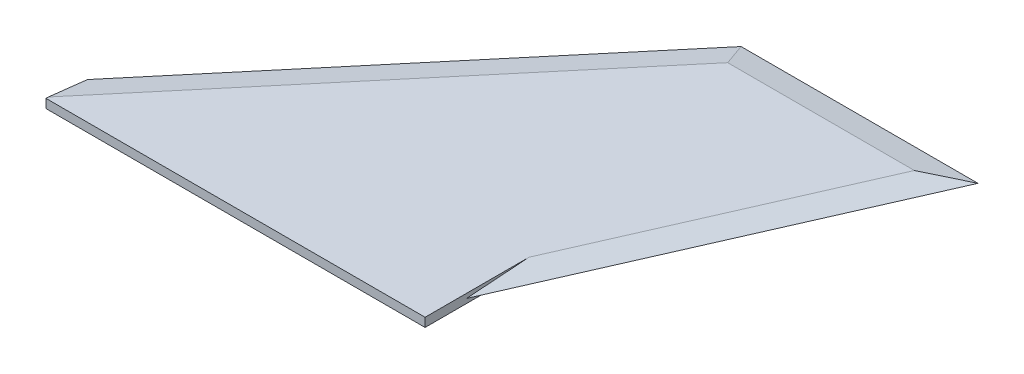
ISO-10303-21;
HEADER;
FILE_DESCRIPTION(('STEP AP214'),'2;1');
FILE_NAME('part.step','',(''),(''),'','','');
FILE_SCHEMA(('AUTOMOTIVE_DESIGN { 1 0 10303 214 1 1 1 1 }'));
ENDSEC;
DATA;
#1=APPLICATION_CONTEXT('core data for automotive mechanical design processes');
#2=APPLICATION_PROTOCOL_DEFINITION('international standard','automotive_design',2000,#1);
#3=PRODUCT_CONTEXT('',#1,'mechanical');
#4=PRODUCT('Part','Part','',(#3));
#5=PRODUCT_RELATED_PRODUCT_CATEGORY('part','',(#4));
#6=PRODUCT_DEFINITION_FORMATION('','',#4);
#7=PRODUCT_DEFINITION_CONTEXT('part definition',#1,'design');
#8=PRODUCT_DEFINITION('design','',#6,#7);
#9=PRODUCT_DEFINITION_SHAPE('','',#8);
#10=(LENGTH_UNIT() NAMED_UNIT(*) SI_UNIT(.MILLI.,.METRE.));
#11=(NAMED_UNIT(*) PLANE_ANGLE_UNIT() SI_UNIT($,.RADIAN.));
#12=(NAMED_UNIT(*) SI_UNIT($,.STERADIAN.) SOLID_ANGLE_UNIT());
#13=UNCERTAINTY_MEASURE_WITH_UNIT(LENGTH_MEASURE(1.E-05),#10,'distance_accuracy_value','');
#14=(GEOMETRIC_REPRESENTATION_CONTEXT(3) GLOBAL_UNCERTAINTY_ASSIGNED_CONTEXT((#13)) GLOBAL_UNIT_ASSIGNED_CONTEXT((#10,
#11,#12)) REPRESENTATION_CONTEXT('',''));
#15=CARTESIAN_POINT('',(0.,0.,0.));
#16=DIRECTION('',(0.,0.,1.));
#17=DIRECTION('',(1.,0.,0.));
#18=AXIS2_PLACEMENT_3D('',#15,#16,#17);
#19=CARTESIAN_POINT('',(101.6,2.3749,0.));
#20=DIRECTION('',(-1.,0.,0.));
#21=DIRECTION('',(0.,0.,1.));
#22=AXIS2_PLACEMENT_3D('',#19,#20,#21);
#23=PLANE('',#22);
#24=DIRECTION('',(0.,0.,-1.));
#25=VECTOR('',#24,1.);
#26=CARTESIAN_POINT('',(101.6,-2.3749,0.));
#27=LINE('',#26,#25);
#28=CARTESIAN_POINT('',(101.6,-2.3749,22.225));
#29=VERTEX_POINT('',#28);
#30=CARTESIAN_POINT('',(101.6,-2.3749,-33.5003114168139));
#31=VERTEX_POINT('',#30);
#32=EDGE_CURVE('E56',#29,#31,#27,.T.);
#33=ORIENTED_EDGE('',*,*,#32,.T.);
#34=DIRECTION('',(0.,0.0707144077689072,0.997496602768096));
#35=VECTOR('',#34,1.);
#36=CARTESIAN_POINT('',(101.6,0.0118757526792581,0.167519227362881));
#37=LINE('',#36,#35);
#38=CARTESIAN_POINT('',(101.6,0.,0.));
#39=VERTEX_POINT('',#38);
#40=EDGE_CURVE('E11',#31,#39,#37,.T.);
#41=ORIENTED_EDGE('',*,*,#40,.T.);
#42=DIRECTION('',(0.,-0.0707144077689075,0.997496602768096));
#43=VECTOR('',#42,1.);
#44=CARTESIAN_POINT('',(101.6,0.0118757526792633,-0.167519227362969));
#45=LINE('',#44,#43);
#46=CARTESIAN_POINT('',(101.6,2.3749,-33.5003114168136));
#47=VERTEX_POINT('',#46);
#48=EDGE_CURVE('E170',#39,#47,#45,.F.);
#49=ORIENTED_EDGE('',*,*,#48,.T.);
#50=DIRECTION('',(0.,0.,-1.));
#51=VECTOR('',#50,1.);
#52=CARTESIAN_POINT('',(101.6,2.3749,0.));
#53=LINE('',#52,#51);
#54=CARTESIAN_POINT('',(101.6,2.3749,22.225));
#55=VERTEX_POINT('',#54);
#56=EDGE_CURVE('E117',#55,#47,#53,.T.);
#57=ORIENTED_EDGE('',*,*,#56,.F.);
#58=DIRECTION('',(0.,-1.,0.));
#59=VECTOR('',#58,1.);
#60=CARTESIAN_POINT('',(101.6,2.3749,22.225));
#61=LINE('',#60,#59);
#62=EDGE_CURVE('E127',#55,#29,#61,.T.);
#63=ORIENTED_EDGE('',*,*,#62,.T.);
#64=EDGE_LOOP('',(#33,#41,#49,#57,#63));
#65=FACE_BOUND('',#64,.T.);
#66=ADVANCED_FACE('F38',(#65),#23,.F.);
#67=CARTESIAN_POINT('',(-101.6,2.3749,22.225));
#68=DIRECTION('',(1.,0.,0.));
#69=DIRECTION('',(0.,0.,-1.));
#70=AXIS2_PLACEMENT_3D('',#67,#68,#69);
#71=PLANE('',#70);
#72=DIRECTION('',(0.,0.112619742461809,0.993638160301745));
#73=VECTOR('',#72,1.);
#74=CARTESIAN_POINT('',(-101.6,-4.59939574289752,-40.5802306467018));
#75=LINE('',#74,#73);
#76=CARTESIAN_POINT('',(-101.6,2.3749,20.9536198122708));
#77=VERTEX_POINT('',#76);
#78=CARTESIAN_POINT('',(-101.6,0.,0.));
#79=VERTEX_POINT('',#78);
#80=EDGE_CURVE('E163',#77,#79,#75,.F.);
#81=ORIENTED_EDGE('',*,*,#80,.T.);
#82=DIRECTION('',(0.,-0.112619742461809,0.993638160301745));
#83=VECTOR('',#82,1.);
#84=CARTESIAN_POINT('',(-101.6,0.,0.));
#85=LINE('',#84,#83);
#86=CARTESIAN_POINT('',(-101.6,-2.3749,20.9536198122709));
#87=VERTEX_POINT('',#86);
#88=EDGE_CURVE('E49',#79,#87,#85,.T.);
#89=ORIENTED_EDGE('',*,*,#88,.T.);
#90=DIRECTION('',(0.,0.,1.));
#91=VECTOR('',#90,1.);
#92=CARTESIAN_POINT('',(-101.6,-2.3749,22.225));
#93=LINE('',#92,#91);
#94=CARTESIAN_POINT('',(-101.6,-2.3749,22.225));
#95=VERTEX_POINT('',#94);
#96=EDGE_CURVE('E123',#87,#95,#93,.T.);
#97=ORIENTED_EDGE('',*,*,#96,.T.);
#98=DIRECTION('',(0.,-1.,0.));
#99=VECTOR('',#98,1.);
#100=CARTESIAN_POINT('',(-101.6,2.3749,22.225));
#101=LINE('',#100,#99);
#102=CARTESIAN_POINT('',(-101.6,2.3749,22.225));
#103=VERTEX_POINT('',#102);
#104=EDGE_CURVE('E120',#103,#95,#101,.T.);
#105=ORIENTED_EDGE('',*,*,#104,.F.);
#106=DIRECTION('',(0.,0.,1.));
#107=VECTOR('',#106,1.);
#108=CARTESIAN_POINT('',(-101.6,2.3749,22.225));
#109=LINE('',#108,#107);
#110=EDGE_CURVE('E106',#77,#103,#109,.T.);
#111=ORIENTED_EDGE('',*,*,#110,.F.);
#112=EDGE_LOOP('',(#81,#89,#97,#105,#111));
#113=FACE_BOUND('',#112,.T.);
#114=ADVANCED_FACE('F121',(#113),#71,.F.);
#115=CARTESIAN_POINT('',(101.6,2.3749,22.225));
#116=DIRECTION('',(0.,0.,-1.));
#117=DIRECTION('',(-1.,0.,0.));
#118=AXIS2_PLACEMENT_3D('',#115,#116,#117);
#119=PLANE('',#118);
#120=DIRECTION('',(1.,0.,0.));
#121=VECTOR('',#120,1.);
#122=CARTESIAN_POINT('',(101.6,-2.3749,22.225));
#123=LINE('',#122,#121);
#124=EDGE_CURVE('E143',#95,#29,#123,.T.);
#125=ORIENTED_EDGE('',*,*,#124,.T.);
#126=ORIENTED_EDGE('',*,*,#62,.F.);
#127=DIRECTION('',(1.,0.,0.));
#128=VECTOR('',#127,1.);
#129=CARTESIAN_POINT('',(101.6,2.3749,22.225));
#130=LINE('',#129,#128);
#131=EDGE_CURVE('E110',#103,#55,#130,.T.);
#132=ORIENTED_EDGE('',*,*,#131,.F.);
#133=ORIENTED_EDGE('',*,*,#104,.T.);
#134=EDGE_LOOP('',(#125,#126,#132,#133));
#135=FACE_BOUND('',#134,.T.);
#136=ADVANCED_FACE('F129',(#135),#119,.F.);
#137=CARTESIAN_POINT('',(0.,2.3749,0.));
#138=DIRECTION('',(0.,-1.,0.));
#139=DIRECTION('',(0.,0.,-1.));
#140=AXIS2_PLACEMENT_3D('',#137,#138,#139);
#141=PLANE('',#140);
#142=ORIENTED_EDGE('',*,*,#56,.T.);
#143=DIRECTION('',(0.402047820565937,0.,-0.915618670614673));
#144=VECTOR('',#143,1.);
#145=CARTESIAN_POINT('',(72.8449089900813,2.3749,31.9861726706874));
#146=LINE('',#145,#144);
#147=CARTESIAN_POINT('',(164.624392208772,2.3749,-177.03127280659));
#148=VERTEX_POINT('',#147);
#149=EDGE_CURVE('E151',#47,#148,#146,.T.);
#150=ORIENTED_EDGE('',*,*,#149,.T.);
#151=DIRECTION('',(-1.,0.,0.));
#152=VECTOR('',#151,1.);
#153=CARTESIAN_POINT('',(0.,2.3749,-177.03127280659));
#154=LINE('',#153,#152);
#155=CARTESIAN_POINT('',(64.52905037516,2.3749,-177.03127280659));
#156=VERTEX_POINT('',#155);
#157=EDGE_CURVE('E148',#148,#156,#154,.T.);
#158=ORIENTED_EDGE('',*,*,#157,.T.);
#159=DIRECTION('',(-0.64278760968654,0.,0.766044443118977));
#160=VECTOR('',#159,1.);
#161=CARTESIAN_POINT('',(-49.3036838030826,2.3749,-41.370702894848));
#162=LINE('',#161,#160);
#163=EDGE_CURVE('E113',#156,#77,#162,.T.);
#164=ORIENTED_EDGE('',*,*,#163,.T.);
#165=ORIENTED_EDGE('',*,*,#110,.T.);
#166=ORIENTED_EDGE('',*,*,#131,.T.);
#167=EDGE_LOOP('',(#142,#150,#158,#164,#165,#166));
#168=FACE_BOUND('',#167,.T.);
#169=ADVANCED_FACE('F108',(#168),#141,.F.);
#170=CARTESIAN_POINT('',(0.,-2.3749,0.));
#171=DIRECTION('',(0.,-1.,0.));
#172=DIRECTION('',(0.,0.,-1.));
#173=AXIS2_PLACEMENT_3D('',#170,#171,#172);
#174=PLANE('',#173);
#175=DIRECTION('',(-0.402047820565937,0.,0.915618670614673));
#176=VECTOR('',#175,1.);
#177=CARTESIAN_POINT('',(89.2677819122981,-2.3749,-5.41507241390777));
#178=LINE('',#177,#176);
#179=CARTESIAN_POINT('',(164.624392208771,-2.3749,-177.03127280659));
#180=VERTEX_POINT('',#179);
#181=EDGE_CURVE('E185',#180,#31,#178,.T.);
#182=ORIENTED_EDGE('',*,*,#181,.T.);
#183=ORIENTED_EDGE('',*,*,#32,.F.);
#184=ORIENTED_EDGE('',*,*,#124,.F.);
#185=ORIENTED_EDGE('',*,*,#96,.F.);
#186=DIRECTION('',(0.64278760968654,0.,-0.766044443118977));
#187=VECTOR('',#186,1.);
#188=CARTESIAN_POINT('',(68.5661233616696,-2.3749,-181.842469041828));
#189=LINE('',#188,#187);
#190=CARTESIAN_POINT('',(64.52905037516,-2.3749,-177.03127280659));
#191=VERTEX_POINT('',#190);
#192=EDGE_CURVE('E174',#87,#191,#189,.T.);
#193=ORIENTED_EDGE('',*,*,#192,.T.);
#194=DIRECTION('',(1.,0.,0.));
#195=VECTOR('',#194,1.);
#196=CARTESIAN_POINT('',(185.248479739272,-2.3749,-177.03127280659));
#197=LINE('',#196,#195);
#198=EDGE_CURVE('E63',#191,#180,#197,.T.);
#199=ORIENTED_EDGE('',*,*,#198,.T.);
#200=EDGE_LOOP('',(#182,#183,#184,#185,#193,#199));
#201=FACE_BOUND('',#200,.T.);
#202=ADVANCED_FACE('F226',(#201),#174,.T.);
#203=CARTESIAN_POINT('',(-49.3036838030826,2.3749,-41.370702894848));
#204=DIRECTION('',(0.133022221559488,-0.984807753012208,0.111618897048949));
#205=DIRECTION('',(-0.64278760968654,0.,0.766044443118977));
#206=AXIS2_PLACEMENT_3D('',#203,#204,#205);
#207=PLANE('',#206);
#208=ORIENTED_EDGE('',*,*,#80,.F.);
#209=ORIENTED_EDGE('',*,*,#163,.F.);
#210=DIRECTION('',(-0.417323032802247,-0.157804207302253,-0.894952131932453));
#211=VECTOR('',#210,1.);
#212=CARTESIAN_POINT('',(95.3711815814297,14.0373717160621,-110.890108991481));
#213=LINE('',#212,#211);
#214=CARTESIAN_POINT('',(58.2484797392724,0.,-190.5));
#215=VERTEX_POINT('',#214);
#216=EDGE_CURVE('E140',#215,#156,#213,.F.);
#217=ORIENTED_EDGE('',*,*,#216,.F.);
#218=DIRECTION('',(0.64278760968654,0.,-0.766044443118977));
#219=VECTOR('',#218,1.);
#220=CARTESIAN_POINT('',(-101.6,0.,0.));
#221=LINE('',#220,#219);
#222=EDGE_CURVE('E166',#79,#215,#221,.T.);
#223=ORIENTED_EDGE('',*,*,#222,.F.);
#224=EDGE_LOOP('',(#208,#209,#217,#223));
#225=FACE_BOUND('',#224,.T.);
#226=ADVANCED_FACE('F207',(#225),#207,.F.);
#227=CARTESIAN_POINT('',(0.,2.3749,-177.03127280659));
#228=DIRECTION('',(0.,-0.984807753012208,0.17364817766693));
#229=DIRECTION('',(-1.,0.,0.));
#230=AXIS2_PLACEMENT_3D('',#227,#228,#229);
#231=PLANE('',#230);
#232=ORIENTED_EDGE('',*,*,#216,.T.);
#233=ORIENTED_EDGE('',*,*,#157,.F.);
#234=DIRECTION('',(0.833407186927812,-0.0959683052793366,-0.544263304990225));
#235=VECTOR('',#234,1.);
#236=CARTESIAN_POINT('',(50.2816332162547,15.5416700658141,-102.358809109252));
#237=LINE('',#236,#235);
#238=CARTESIAN_POINT('',(185.248479739272,0.,-190.5));
#239=VERTEX_POINT('',#238);
#240=EDGE_CURVE('E175',#239,#148,#237,.F.);
#241=ORIENTED_EDGE('',*,*,#240,.F.);
#242=DIRECTION('',(1.,0.,0.));
#243=VECTOR('',#242,1.);
#244=CARTESIAN_POINT('',(58.2484797392724,0.,-190.5));
#245=LINE('',#244,#243);
#246=EDGE_CURVE('E159',#215,#239,#245,.T.);
#247=ORIENTED_EDGE('',*,*,#246,.F.);
#248=EDGE_LOOP('',(#232,#233,#241,#247));
#249=FACE_BOUND('',#248,.T.);
#250=ADVANCED_FACE('F211',(#249),#231,.F.);
#251=CARTESIAN_POINT('',(72.8449089900813,2.3749,31.9861726706874));
#252=DIRECTION('',(-0.158995513590055,-0.984807753012208,-0.0698148713762359));
#253=DIRECTION('',(0.402047820565937,0.,-0.915618670614673));
#254=AXIS2_PLACEMENT_3D('',#251,#252,#253);
#255=PLANE('',#254);
#256=ORIENTED_EDGE('',*,*,#48,.F.);
#257=DIRECTION('',(-0.402047820565937,0.,0.915618670614673));
#258=VECTOR('',#257,1.);
#259=CARTESIAN_POINT('',(185.248479739272,0.,-190.5));
#260=LINE('',#259,#258);
#261=EDGE_CURVE('E155',#239,#39,#260,.T.);
#262=ORIENTED_EDGE('',*,*,#261,.F.);
#263=ORIENTED_EDGE('',*,*,#240,.T.);
#264=ORIENTED_EDGE('',*,*,#149,.F.);
#265=EDGE_LOOP('',(#256,#262,#263,#264));
#266=FACE_BOUND('',#265,.T.);
#267=ADVANCED_FACE('F215',(#266),#255,.F.);
#268=CARTESIAN_POINT('',(-101.6,0.,0.));
#269=DIRECTION('',(-0.133022221559488,-0.984807753012208,-0.111618897048949));
#270=DIRECTION('',(0.64278760968654,0.,-0.766044443118977));
#271=AXIS2_PLACEMENT_3D('',#268,#269,#270);
#272=PLANE('',#271);
#273=ORIENTED_EDGE('',*,*,#88,.F.);
#274=ORIENTED_EDGE('',*,*,#222,.T.);
#275=DIRECTION('',(0.417323032802244,-0.157804207302253,0.894952131932454));
#276=VECTOR('',#275,1.);
#277=CARTESIAN_POINT('',(101.558234361539,-16.376909394935,-97.6219314869782));
#278=LINE('',#277,#276);
#279=EDGE_CURVE('E43',#191,#215,#278,.F.);
#280=ORIENTED_EDGE('',*,*,#279,.F.);
#281=ORIENTED_EDGE('',*,*,#192,.F.);
#282=EDGE_LOOP('',(#273,#274,#280,#281));
#283=FACE_BOUND('',#282,.T.);
#284=ADVANCED_FACE('F41',(#283),#272,.T.);
#285=CARTESIAN_POINT('',(58.2484797392724,0.,-190.5));
#286=DIRECTION('',(0.,-0.984807753012208,-0.173648177666929));
#287=DIRECTION('',(1.,0.,0.));
#288=AXIS2_PLACEMENT_3D('',#285,#286,#287);
#289=PLANE('',#288);
#290=ORIENTED_EDGE('',*,*,#279,.T.);
#291=ORIENTED_EDGE('',*,*,#246,.T.);
#292=DIRECTION('',(-0.833407186927813,-0.0959683052793362,0.544263304990224));
#293=VECTOR('',#292,1.);
#294=CARTESIAN_POINT('',(97.0384022579602,-10.1575457678093,-132.893695355088));
#295=LINE('',#294,#293);
#296=EDGE_CURVE('E189',#180,#239,#295,.F.);
#297=ORIENTED_EDGE('',*,*,#296,.F.);
#298=ORIENTED_EDGE('',*,*,#198,.F.);
#299=EDGE_LOOP('',(#290,#291,#297,#298));
#300=FACE_BOUND('',#299,.T.);
#301=ADVANCED_FACE('F199',(#300),#289,.T.);
#302=CARTESIAN_POINT('',(185.248479739272,0.,-190.5));
#303=DIRECTION('',(0.158995513590054,-0.984807753012208,0.0698148713762355));
#304=DIRECTION('',(-0.402047820565937,0.,0.915618670614673));
#305=AXIS2_PLACEMENT_3D('',#302,#303,#304);
#306=PLANE('',#305);
#307=ORIENTED_EDGE('',*,*,#40,.F.);
#308=ORIENTED_EDGE('',*,*,#181,.F.);
#309=ORIENTED_EDGE('',*,*,#296,.T.);
#310=ORIENTED_EDGE('',*,*,#261,.T.);
#311=EDGE_LOOP('',(#307,#308,#309,#310));
#312=FACE_BOUND('',#311,.T.);
#313=ADVANCED_FACE('F217',(#312),#306,.T.);
#314=CLOSED_SHELL('',(#66,#114,#136,#169,#202,#226,#250,#267,#284,#301,#313));
#315=MANIFOLD_SOLID_BREP('B2',#314);
#316=ADVANCED_BREP_SHAPE_REPRESENTATION('',(#18,#315),#14);
#317=SHAPE_DEFINITION_REPRESENTATION(#9,#316);
ENDSEC;
END-ISO-10303-21;
